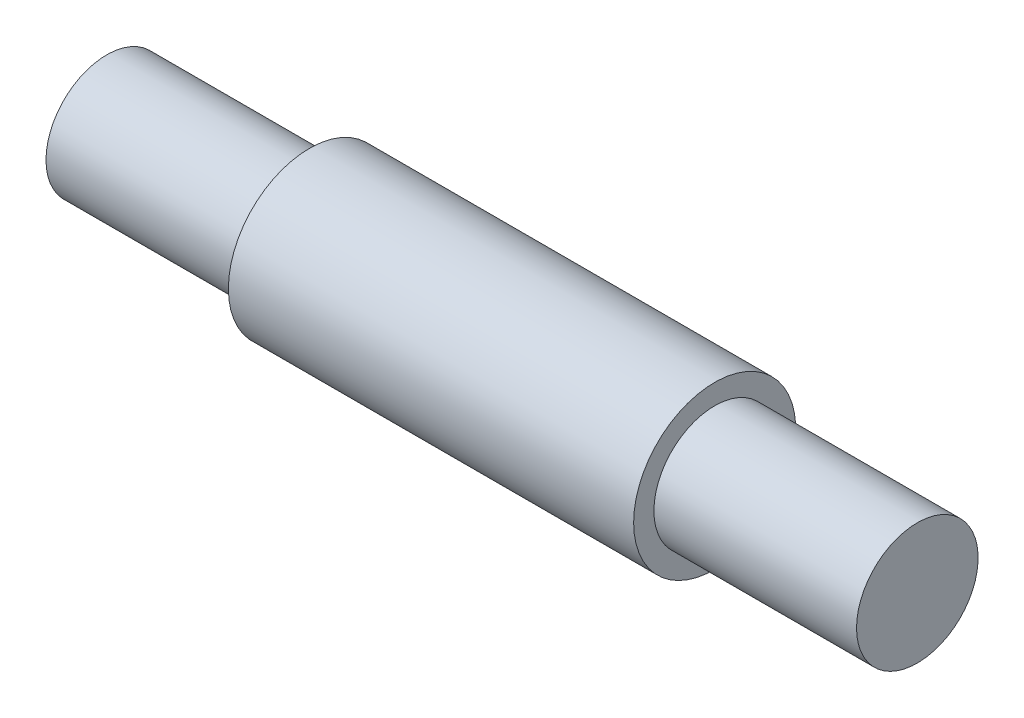
ISO-10303-21;
HEADER;
FILE_DESCRIPTION(('STEP AP214'),'2;1');
FILE_NAME('part.step','',(''),(''),'','','');
FILE_SCHEMA(('AUTOMOTIVE_DESIGN { 1 0 10303 214 1 1 1 1 }'));
ENDSEC;
DATA;
#1=APPLICATION_CONTEXT('core data for automotive mechanical design processes');
#2=APPLICATION_PROTOCOL_DEFINITION('international standard','automotive_design',2000,#1);
#3=PRODUCT_CONTEXT('',#1,'mechanical');
#4=PRODUCT('Part','Part','',(#3));
#5=PRODUCT_RELATED_PRODUCT_CATEGORY('part','',(#4));
#6=PRODUCT_DEFINITION_FORMATION('','',#4);
#7=PRODUCT_DEFINITION_CONTEXT('part definition',#1,'design');
#8=PRODUCT_DEFINITION('design','',#6,#7);
#9=PRODUCT_DEFINITION_SHAPE('','',#8);
#10=(LENGTH_UNIT() NAMED_UNIT(*) SI_UNIT(.MILLI.,.METRE.));
#11=(NAMED_UNIT(*) PLANE_ANGLE_UNIT() SI_UNIT($,.RADIAN.));
#12=(NAMED_UNIT(*) SI_UNIT($,.STERADIAN.) SOLID_ANGLE_UNIT());
#13=UNCERTAINTY_MEASURE_WITH_UNIT(LENGTH_MEASURE(1.E-05),#10,'distance_accuracy_value','');
#14=(GEOMETRIC_REPRESENTATION_CONTEXT(3) GLOBAL_UNCERTAINTY_ASSIGNED_CONTEXT((#13)) GLOBAL_UNIT_ASSIGNED_CONTEXT((#10,
#11,#12)) REPRESENTATION_CONTEXT('',''));
#15=CARTESIAN_POINT('',(0.,0.,0.));
#16=DIRECTION('',(0.,0.,1.));
#17=DIRECTION('',(1.,0.,0.));
#18=AXIS2_PLACEMENT_3D('',#15,#16,#17);
#19=CARTESIAN_POINT('',(40.,0.,0.));
#20=DIRECTION('',(-1.,0.,0.));
#21=DIRECTION('',(0.,0.,1.));
#22=AXIS2_PLACEMENT_3D('',#19,#20,#21);
#23=PLANE('',#22);
#24=CARTESIAN_POINT('',(40.,0.,0.));
#25=DIRECTION('',(-1.,0.,0.));
#26=DIRECTION('',(0.,0.,1.));
#27=AXIS2_PLACEMENT_3D('',#24,#25,#26);
#28=CIRCLE('',#27,6.);
#29=CARTESIAN_POINT('',(40.,0.,6.));
#30=VERTEX_POINT('',#29);
#31=EDGE_CURVE('E57',#30,#30,#28,.T.);
#32=ORIENTED_EDGE('',*,*,#31,.F.);
#33=EDGE_LOOP('',(#32));
#34=FACE_BOUND('',#33,.T.);
#35=ADVANCED_FACE('F35',(#34),#23,.F.);
#36=CARTESIAN_POINT('',(-40.,0.,0.));
#37=DIRECTION('',(1.,0.,0.));
#38=DIRECTION('',(0.,0.,-1.));
#39=AXIS2_PLACEMENT_3D('',#36,#37,#38);
#40=PLANE('',#39);
#41=CARTESIAN_POINT('',(-40.,0.,0.));
#42=DIRECTION('',(-1.,0.,0.));
#43=DIRECTION('',(0.,0.,1.));
#44=AXIS2_PLACEMENT_3D('',#41,#42,#43);
#45=CIRCLE('',#44,5.99999999999999);
#46=CARTESIAN_POINT('',(-40.,0.,5.99999999999999));
#47=VERTEX_POINT('',#46);
#48=EDGE_CURVE('E10',#47,#47,#45,.T.);
#49=ORIENTED_EDGE('',*,*,#48,.T.);
#50=EDGE_LOOP('',(#49));
#51=FACE_BOUND('',#50,.T.);
#52=ADVANCED_FACE('F64',(#51),#40,.F.);
#53=CARTESIAN_POINT('',(-50.,0.,0.));
#54=DIRECTION('',(-1.,0.,0.));
#55=DIRECTION('',(0.,0.,1.));
#56=AXIS2_PLACEMENT_3D('',#53,#54,#55);
#57=CYLINDRICAL_SURFACE('',#56,5.99999999999999);
#58=ORIENTED_EDGE('',*,*,#48,.F.);
#59=EDGE_LOOP('',(#58));
#60=FACE_BOUND('',#59,.T.);
#61=CARTESIAN_POINT('',(-20.,0.,0.));
#62=DIRECTION('',(-1.,0.,0.));
#63=DIRECTION('',(0.,0.,1.));
#64=AXIS2_PLACEMENT_3D('',#61,#62,#63);
#65=CIRCLE('',#64,5.99999999999999);
#66=CARTESIAN_POINT('',(-20.,0.,5.99999999999999));
#67=VERTEX_POINT('',#66);
#68=EDGE_CURVE('E41',#67,#67,#65,.T.);
#69=ORIENTED_EDGE('',*,*,#68,.T.);
#70=EDGE_LOOP('',(#69));
#71=FACE_BOUND('',#70,.T.);
#72=ADVANCED_FACE('F68',(#60,#71),#57,.T.);
#73=CARTESIAN_POINT('',(-20.,5.99999999999999,0.));
#74=DIRECTION('',(1.,0.,0.));
#75=DIRECTION('',(0.,0.,-1.));
#76=AXIS2_PLACEMENT_3D('',#73,#74,#75);
#77=PLANE('',#76);
#78=ORIENTED_EDGE('',*,*,#68,.F.);
#79=EDGE_LOOP('',(#78));
#80=FACE_BOUND('',#79,.T.);
#81=CARTESIAN_POINT('',(-20.,0.,0.));
#82=DIRECTION('',(-1.,0.,0.));
#83=DIRECTION('',(0.,0.,1.));
#84=AXIS2_PLACEMENT_3D('',#81,#82,#83);
#85=CIRCLE('',#84,7.99999999999999);
#86=CARTESIAN_POINT('',(-20.,0.,7.99999999999999));
#87=VERTEX_POINT('',#86);
#88=EDGE_CURVE('E45',#87,#87,#85,.T.);
#89=ORIENTED_EDGE('',*,*,#88,.T.);
#90=EDGE_LOOP('',(#89));
#91=FACE_BOUND('',#90,.T.);
#92=ADVANCED_FACE('F72',(#80,#91),#77,.F.);
#93=CARTESIAN_POINT('',(-50.,0.,0.));
#94=DIRECTION('',(-1.,0.,0.));
#95=DIRECTION('',(0.,0.,1.));
#96=AXIS2_PLACEMENT_3D('',#93,#94,#95);
#97=CYLINDRICAL_SURFACE('',#96,8.);
#98=ORIENTED_EDGE('',*,*,#88,.F.);
#99=EDGE_LOOP('',(#98));
#100=FACE_BOUND('',#99,.T.);
#101=CARTESIAN_POINT('',(20.,0.,0.));
#102=DIRECTION('',(-1.,0.,0.));
#103=DIRECTION('',(0.,0.,1.));
#104=AXIS2_PLACEMENT_3D('',#101,#102,#103);
#105=CIRCLE('',#104,8.);
#106=CARTESIAN_POINT('',(20.,0.,8.));
#107=VERTEX_POINT('',#106);
#108=EDGE_CURVE('E49',#107,#107,#105,.T.);
#109=ORIENTED_EDGE('',*,*,#108,.T.);
#110=EDGE_LOOP('',(#109));
#111=FACE_BOUND('',#110,.T.);
#112=ADVANCED_FACE('F78',(#100,#111),#97,.T.);
#113=CARTESIAN_POINT('',(20.,6.,0.));
#114=DIRECTION('',(-1.,0.,0.));
#115=DIRECTION('',(0.,0.,1.));
#116=AXIS2_PLACEMENT_3D('',#113,#114,#115);
#117=PLANE('',#116);
#118=ORIENTED_EDGE('',*,*,#108,.F.);
#119=EDGE_LOOP('',(#118));
#120=FACE_BOUND('',#119,.T.);
#121=CARTESIAN_POINT('',(20.,0.,0.));
#122=DIRECTION('',(-1.,0.,0.));
#123=DIRECTION('',(0.,0.,1.));
#124=AXIS2_PLACEMENT_3D('',#121,#122,#123);
#125=CIRCLE('',#124,6.);
#126=CARTESIAN_POINT('',(20.,0.,6.));
#127=VERTEX_POINT('',#126);
#128=EDGE_CURVE('E54',#127,#127,#125,.T.);
#129=ORIENTED_EDGE('',*,*,#128,.T.);
#130=EDGE_LOOP('',(#129));
#131=FACE_BOUND('',#130,.T.);
#132=ADVANCED_FACE('F82',(#120,#131),#117,.F.);
#133=CARTESIAN_POINT('',(-50.,0.,0.));
#134=DIRECTION('',(-1.,0.,0.));
#135=DIRECTION('',(0.,0.,1.));
#136=AXIS2_PLACEMENT_3D('',#133,#134,#135);
#137=CYLINDRICAL_SURFACE('',#136,6.);
#138=ORIENTED_EDGE('',*,*,#128,.F.);
#139=EDGE_LOOP('',(#138));
#140=FACE_BOUND('',#139,.T.);
#141=ORIENTED_EDGE('',*,*,#31,.T.);
#142=EDGE_LOOP('',(#141));
#143=FACE_BOUND('',#142,.T.);
#144=ADVANCED_FACE('F61',(#140,#143),#137,.T.);
#145=CLOSED_SHELL('',(#35,#52,#72,#92,#112,#132,#144));
#146=MANIFOLD_SOLID_BREP('B2',#145);
#147=ADVANCED_BREP_SHAPE_REPRESENTATION('',(#18,#146),#14);
#148=SHAPE_DEFINITION_REPRESENTATION(#9,#147);
ENDSEC;
END-ISO-10303-21;
